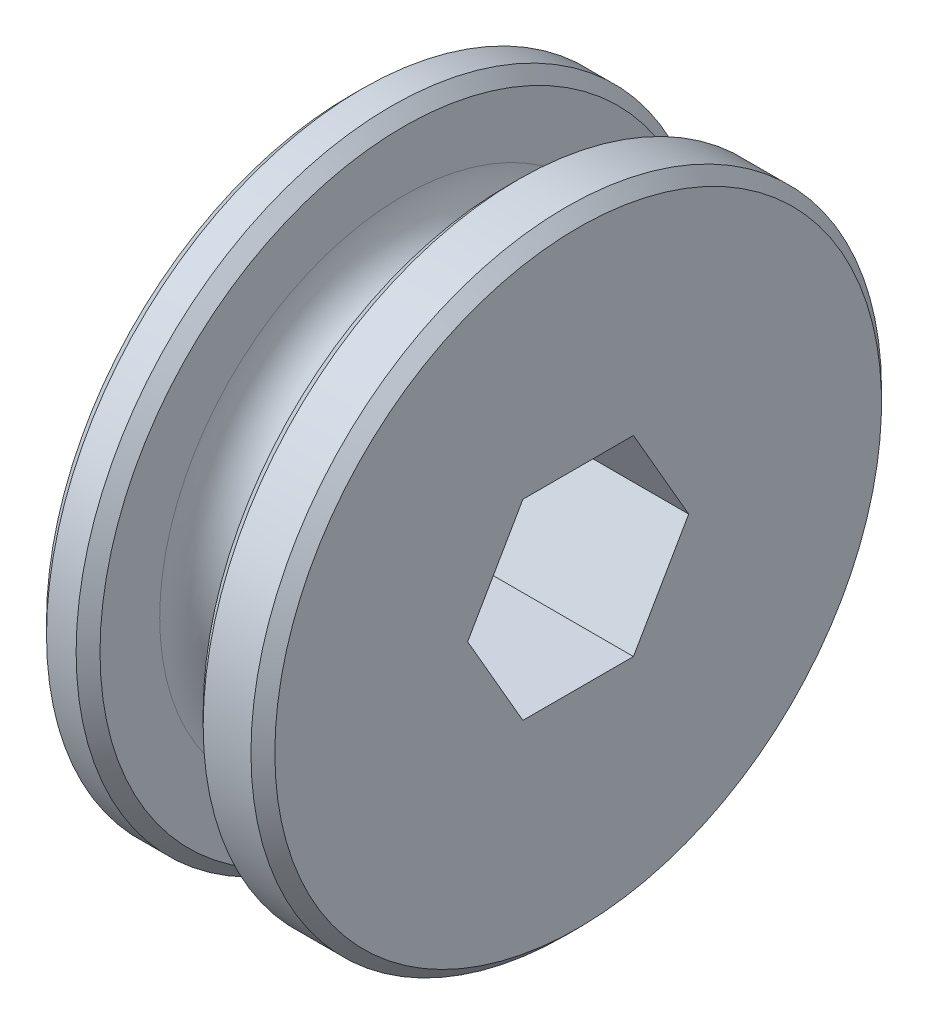
ISO-10303-21;
HEADER;
FILE_DESCRIPTION(('STEP AP214'),'2;1');
FILE_NAME('part.step','',(''),(''),'','','');
FILE_SCHEMA(('AUTOMOTIVE_DESIGN { 1 0 10303 214 1 1 1 1 }'));
ENDSEC;
DATA;
#1=APPLICATION_CONTEXT('core data for automotive mechanical design processes');
#2=APPLICATION_PROTOCOL_DEFINITION('international standard','automotive_design',2000,#1);
#3=PRODUCT_CONTEXT('',#1,'mechanical');
#4=PRODUCT('Part','Part','',(#3));
#5=PRODUCT_RELATED_PRODUCT_CATEGORY('part','',(#4));
#6=PRODUCT_DEFINITION_FORMATION('','',#4);
#7=PRODUCT_DEFINITION_CONTEXT('part definition',#1,'design');
#8=PRODUCT_DEFINITION('design','',#6,#7);
#9=PRODUCT_DEFINITION_SHAPE('','',#8);
#10=(LENGTH_UNIT() NAMED_UNIT(*) SI_UNIT(.MILLI.,.METRE.));
#11=(NAMED_UNIT(*) PLANE_ANGLE_UNIT() SI_UNIT($,.RADIAN.));
#12=(NAMED_UNIT(*) SI_UNIT($,.STERADIAN.) SOLID_ANGLE_UNIT());
#13=UNCERTAINTY_MEASURE_WITH_UNIT(LENGTH_MEASURE(1.E-05),#10,'distance_accuracy_value','');
#14=(GEOMETRIC_REPRESENTATION_CONTEXT(3) GLOBAL_UNCERTAINTY_ASSIGNED_CONTEXT((#13)) GLOBAL_UNIT_ASSIGNED_CONTEXT((#10,
#11,#12)) REPRESENTATION_CONTEXT('',''));
#15=CARTESIAN_POINT('',(0.,0.,0.));
#16=DIRECTION('',(0.,0.,1.));
#17=DIRECTION('',(1.,0.,0.));
#18=AXIS2_PLACEMENT_3D('',#15,#16,#17);
#19=CARTESIAN_POINT('',(6.985,0.,0.));
#20=DIRECTION('',(-1.,0.,0.));
#21=DIRECTION('',(0.,0.,1.));
#22=AXIS2_PLACEMENT_3D('',#19,#20,#21);
#23=TOROIDAL_SURFACE('',#22,16.1925,3.429);
#24=CARTESIAN_POINT('',(10.414,0.,0.));
#25=DIRECTION('',(-1.,0.,0.));
#26=DIRECTION('',(0.,0.,1.));
#27=AXIS2_PLACEMENT_3D('',#24,#25,#26);
#28=CIRCLE('',#27,16.1925);
#29=CARTESIAN_POINT('',(10.414,0.,16.1925));
#30=VERTEX_POINT('',#29);
#31=EDGE_CURVE('E141',#30,#30,#28,.T.);
#32=ORIENTED_EDGE('',*,*,#31,.T.);
#33=EDGE_LOOP('',(#32));
#34=FACE_BOUND('',#33,.T.);
#35=CARTESIAN_POINT('',(3.556,0.,0.));
#36=DIRECTION('',(-1.,0.,0.));
#37=DIRECTION('',(0.,0.,1.));
#38=AXIS2_PLACEMENT_3D('',#35,#36,#37);
#39=CIRCLE('',#38,16.1925);
#40=CARTESIAN_POINT('',(3.556,0.,16.1925));
#41=VERTEX_POINT('',#40);
#42=EDGE_CURVE('E151',#41,#41,#39,.T.);
#43=ORIENTED_EDGE('',*,*,#42,.F.);
#44=EDGE_LOOP('',(#43));
#45=FACE_BOUND('',#44,.T.);
#46=ADVANCED_FACE('F43',(#34,#45),#23,.F.);
#47=CARTESIAN_POINT('',(3.556,0.,0.));
#48=DIRECTION('',(-1.,0.,0.));
#49=DIRECTION('',(0.,0.,1.));
#50=AXIS2_PLACEMENT_3D('',#47,#48,#49);
#51=PLANE('',#50);
#52=CARTESIAN_POINT('',(3.556,0.,0.));
#53=DIRECTION('',(-1.,0.,0.));
#54=DIRECTION('',(0.,0.,1.));
#55=AXIS2_PLACEMENT_3D('',#52,#53,#54);
#56=CIRCLE('',#55,20.16125);
#57=CARTESIAN_POINT('',(3.556,0.,20.16125));
#58=VERTEX_POINT('',#57);
#59=EDGE_CURVE('E11',#58,#58,#56,.F.);
#60=ORIENTED_EDGE('',*,*,#59,.T.);
#61=EDGE_LOOP('',(#60));
#62=FACE_BOUND('',#61,.T.);
#63=ORIENTED_EDGE('',*,*,#42,.T.);
#64=EDGE_LOOP('',(#63));
#65=FACE_BOUND('',#64,.T.);
#66=ADVANCED_FACE('F187',(#62,#65),#51,.F.);
#67=CARTESIAN_POINT('',(0.,0.,0.));
#68=DIRECTION('',(-1.,0.,0.));
#69=DIRECTION('',(0.,0.,1.));
#70=AXIS2_PLACEMENT_3D('',#67,#68,#69);
#71=CYLINDRICAL_SURFACE('',#70,20.955);
#72=CARTESIAN_POINT('',(2.76225,0.,0.));
#73=DIRECTION('',(-1.,0.,0.));
#74=DIRECTION('',(0.,0.,1.));
#75=AXIS2_PLACEMENT_3D('',#72,#73,#74);
#76=CIRCLE('',#75,20.955);
#77=CARTESIAN_POINT('',(2.76225,0.,20.955));
#78=VERTEX_POINT('',#77);
#79=EDGE_CURVE('E52',#78,#78,#76,.T.);
#80=ORIENTED_EDGE('',*,*,#79,.T.);
#81=EDGE_LOOP('',(#80));
#82=FACE_BOUND('',#81,.T.);
#83=CARTESIAN_POINT('',(0.793750000000013,0.,0.));
#84=DIRECTION('',(-1.,0.,0.));
#85=DIRECTION('',(0.,0.,1.));
#86=AXIS2_PLACEMENT_3D('',#83,#84,#85);
#87=CIRCLE('',#86,20.955);
#88=CARTESIAN_POINT('',(0.793750000000013,0.,20.955));
#89=VERTEX_POINT('',#88);
#90=EDGE_CURVE('E157',#89,#89,#87,.F.);
#91=ORIENTED_EDGE('',*,*,#90,.T.);
#92=EDGE_LOOP('',(#91));
#93=FACE_BOUND('',#92,.T.);
#94=ADVANCED_FACE('F174',(#82,#93),#71,.T.);
#95=CARTESIAN_POINT('',(0.,0.,0.));
#96=DIRECTION('',(-1.,0.,0.));
#97=DIRECTION('',(0.,0.,1.));
#98=AXIS2_PLACEMENT_3D('',#95,#96,#97);
#99=PLANE('',#98);
#100=DIRECTION('',(0.,0.,1.));
#101=VECTOR('',#100,1.);
#102=CARTESIAN_POINT('',(0.,-6.3627,-3.67350655777283));
#103=LINE('',#102,#101);
#104=CARTESIAN_POINT('',(0.,-6.3627,-3.67350655777283));
#105=VERTEX_POINT('',#104);
#106=CARTESIAN_POINT('',(0.,-6.3627,3.67350655777283));
#107=VERTEX_POINT('',#106);
#108=EDGE_CURVE('E59',#105,#107,#103,.T.);
#109=ORIENTED_EDGE('',*,*,#108,.F.);
#110=DIRECTION('',(0.,-0.866025403784439,0.5));
#111=VECTOR('',#110,1.);
#112=CARTESIAN_POINT('',(0.,0.,-7.34701311554566));
#113=LINE('',#112,#111);
#114=CARTESIAN_POINT('',(0.,0.,-7.34701311554566));
#115=VERTEX_POINT('',#114);
#116=EDGE_CURVE('E115',#115,#105,#113,.T.);
#117=ORIENTED_EDGE('',*,*,#116,.F.);
#118=DIRECTION('',(0.,-0.866025403784439,-0.5));
#119=VECTOR('',#118,1.);
#120=CARTESIAN_POINT('',(0.,6.3627,-3.67350655777283));
#121=LINE('',#120,#119);
#122=CARTESIAN_POINT('',(0.,6.3627,-3.67350655777283));
#123=VERTEX_POINT('',#122);
#124=EDGE_CURVE('E118',#123,#115,#121,.T.);
#125=ORIENTED_EDGE('',*,*,#124,.F.);
#126=DIRECTION('',(0.,0.,-1.));
#127=VECTOR('',#126,1.);
#128=CARTESIAN_POINT('',(0.,6.3627,3.67350655777283));
#129=LINE('',#128,#127);
#130=CARTESIAN_POINT('',(0.,6.3627,3.67350655777283));
#131=VERTEX_POINT('',#130);
#132=EDGE_CURVE('E134',#131,#123,#129,.T.);
#133=ORIENTED_EDGE('',*,*,#132,.F.);
#134=DIRECTION('',(0.,0.866025403784439,-0.5));
#135=VECTOR('',#134,1.);
#136=CARTESIAN_POINT('',(0.,0.,7.34701311554566));
#137=LINE('',#136,#135);
#138=CARTESIAN_POINT('',(0.,0.,7.34701311554566));
#139=VERTEX_POINT('',#138);
#140=EDGE_CURVE('E131',#139,#131,#137,.T.);
#141=ORIENTED_EDGE('',*,*,#140,.F.);
#142=DIRECTION('',(0.,0.866025403784439,0.5));
#143=VECTOR('',#142,1.);
#144=CARTESIAN_POINT('',(0.,-6.3627,3.67350655777283));
#145=LINE('',#144,#143);
#146=EDGE_CURVE('E129',#107,#139,#145,.T.);
#147=ORIENTED_EDGE('',*,*,#146,.F.);
#148=EDGE_LOOP('',(#109,#117,#125,#133,#141,#147));
#149=FACE_BOUND('',#148,.T.);
#150=CARTESIAN_POINT('',(0.,0.,0.));
#151=DIRECTION('',(-1.,0.,0.));
#152=DIRECTION('',(0.,0.,1.));
#153=AXIS2_PLACEMENT_3D('',#150,#151,#152);
#154=CIRCLE('',#153,20.16125);
#155=CARTESIAN_POINT('',(0.,0.,20.16125));
#156=VERTEX_POINT('',#155);
#157=EDGE_CURVE('E154',#156,#156,#154,.T.);
#158=ORIENTED_EDGE('',*,*,#157,.T.);
#159=EDGE_LOOP('',(#158));
#160=FACE_BOUND('',#159,.T.);
#161=ADVANCED_FACE('F243',(#149,#160),#99,.T.);
#162=CARTESIAN_POINT('',(15.1765,0.,0.));
#163=DIRECTION('',(-1.,0.,0.));
#164=DIRECTION('',(0.,0.,1.));
#165=AXIS2_PLACEMENT_3D('',#162,#163,#164);
#166=PLANE('',#165);
#167=CARTESIAN_POINT('',(15.1765,0.,0.));
#168=DIRECTION('',(-1.,0.,0.));
#169=DIRECTION('',(0.,0.,1.));
#170=AXIS2_PLACEMENT_3D('',#167,#168,#169);
#171=CIRCLE('',#170,20.16125);
#172=CARTESIAN_POINT('',(15.1765,0.,20.16125));
#173=VERTEX_POINT('',#172);
#174=EDGE_CURVE('E166',#173,#173,#171,.F.);
#175=ORIENTED_EDGE('',*,*,#174,.T.);
#176=EDGE_LOOP('',(#175));
#177=FACE_BOUND('',#176,.T.);
#178=DIRECTION('',(0.,-0.866025403784439,0.5));
#179=VECTOR('',#178,1.);
#180=CARTESIAN_POINT('',(15.1765,0.,-7.34701311554566));
#181=LINE('',#180,#179);
#182=CARTESIAN_POINT('',(15.1765,0.,-7.34701311554566));
#183=VERTEX_POINT('',#182);
#184=CARTESIAN_POINT('',(15.1765,-6.3627,-3.67350655777283));
#185=VERTEX_POINT('',#184);
#186=EDGE_CURVE('E105',#183,#185,#181,.T.);
#187=ORIENTED_EDGE('',*,*,#186,.T.);
#188=DIRECTION('',(0.,0.,1.));
#189=VECTOR('',#188,1.);
#190=CARTESIAN_POINT('',(15.1765,-6.3627,-3.67350655777283));
#191=LINE('',#190,#189);
#192=CARTESIAN_POINT('',(15.1765,-6.3627,3.67350655777283));
#193=VERTEX_POINT('',#192);
#194=EDGE_CURVE('E99',#185,#193,#191,.T.);
#195=ORIENTED_EDGE('',*,*,#194,.T.);
#196=DIRECTION('',(0.,0.866025403784439,0.5));
#197=VECTOR('',#196,1.);
#198=CARTESIAN_POINT('',(15.1765,-6.3627,3.67350655777283));
#199=LINE('',#198,#197);
#200=CARTESIAN_POINT('',(15.1765,0.,7.34701311554566));
#201=VERTEX_POINT('',#200);
#202=EDGE_CURVE('E108',#193,#201,#199,.T.);
#203=ORIENTED_EDGE('',*,*,#202,.T.);
#204=DIRECTION('',(0.,0.866025403784439,-0.5));
#205=VECTOR('',#204,1.);
#206=CARTESIAN_POINT('',(15.1765,0.,7.34701311554566));
#207=LINE('',#206,#205);
#208=CARTESIAN_POINT('',(15.1765,6.3627,3.67350655777283));
#209=VERTEX_POINT('',#208);
#210=EDGE_CURVE('E67',#201,#209,#207,.T.);
#211=ORIENTED_EDGE('',*,*,#210,.T.);
#212=DIRECTION('',(0.,0.,-1.));
#213=VECTOR('',#212,1.);
#214=CARTESIAN_POINT('',(15.1765,6.3627,3.67350655777283));
#215=LINE('',#214,#213);
#216=CARTESIAN_POINT('',(15.1765,6.3627,-3.67350655777283));
#217=VERTEX_POINT('',#216);
#218=EDGE_CURVE('E122',#209,#217,#215,.T.);
#219=ORIENTED_EDGE('',*,*,#218,.T.);
#220=DIRECTION('',(0.,-0.866025403784439,-0.5));
#221=VECTOR('',#220,1.);
#222=CARTESIAN_POINT('',(15.1765,6.3627,-3.67350655777283));
#223=LINE('',#222,#221);
#224=EDGE_CURVE('E125',#217,#183,#223,.T.);
#225=ORIENTED_EDGE('',*,*,#224,.T.);
#226=EDGE_LOOP('',(#187,#195,#203,#211,#219,#225));
#227=FACE_BOUND('',#226,.T.);
#228=ADVANCED_FACE('F112',(#177,#227),#166,.F.);
#229=CARTESIAN_POINT('',(0.,0.,0.));
#230=DIRECTION('',(-1.,0.,0.));
#231=DIRECTION('',(0.,0.,1.));
#232=AXIS2_PLACEMENT_3D('',#229,#230,#231);
#233=CYLINDRICAL_SURFACE('',#232,20.955);
#234=CARTESIAN_POINT('',(14.38275,0.,0.));
#235=DIRECTION('',(-1.,0.,0.));
#236=DIRECTION('',(0.,0.,1.));
#237=AXIS2_PLACEMENT_3D('',#234,#235,#236);
#238=CIRCLE('',#237,20.955);
#239=CARTESIAN_POINT('',(14.38275,0.,20.955));
#240=VERTEX_POINT('',#239);
#241=EDGE_CURVE('E163',#240,#240,#238,.T.);
#242=ORIENTED_EDGE('',*,*,#241,.T.);
#243=EDGE_LOOP('',(#242));
#244=FACE_BOUND('',#243,.T.);
#245=CARTESIAN_POINT('',(11.20775,0.,0.));
#246=DIRECTION('',(-1.,0.,0.));
#247=DIRECTION('',(0.,0.,1.));
#248=AXIS2_PLACEMENT_3D('',#245,#246,#247);
#249=CIRCLE('',#248,20.955);
#250=CARTESIAN_POINT('',(11.20775,0.,20.955));
#251=VERTEX_POINT('',#250);
#252=EDGE_CURVE('E160',#251,#251,#249,.F.);
#253=ORIENTED_EDGE('',*,*,#252,.T.);
#254=EDGE_LOOP('',(#253));
#255=FACE_BOUND('',#254,.T.);
#256=ADVANCED_FACE('F225',(#244,#255),#233,.T.);
#257=CARTESIAN_POINT('',(10.414,0.,0.));
#258=DIRECTION('',(-1.,0.,0.));
#259=DIRECTION('',(0.,0.,1.));
#260=AXIS2_PLACEMENT_3D('',#257,#258,#259);
#261=PLANE('',#260);
#262=CARTESIAN_POINT('',(10.414,0.,0.));
#263=DIRECTION('',(-1.,0.,0.));
#264=DIRECTION('',(0.,0.,1.));
#265=AXIS2_PLACEMENT_3D('',#262,#263,#264);
#266=CIRCLE('',#265,20.16125);
#267=CARTESIAN_POINT('',(10.414,0.,20.16125));
#268=VERTEX_POINT('',#267);
#269=EDGE_CURVE('E169',#268,#268,#266,.T.);
#270=ORIENTED_EDGE('',*,*,#269,.T.);
#271=EDGE_LOOP('',(#270));
#272=FACE_BOUND('',#271,.T.);
#273=ORIENTED_EDGE('',*,*,#31,.F.);
#274=EDGE_LOOP('',(#273));
#275=FACE_BOUND('',#274,.T.);
#276=ADVANCED_FACE('F205',(#272,#275),#261,.T.);
#277=CARTESIAN_POINT('',(0.,0.,0.));
#278=DIRECTION('',(1.,0.,0.));
#279=DIRECTION('',(0.,0.,-1.));
#280=AXIS2_PLACEMENT_3D('',#277,#278,#279);
#281=CONICAL_SURFACE('',#280,20.16125,0.78539816339744);
#282=ORIENTED_EDGE('',*,*,#90,.F.);
#283=EDGE_LOOP('',(#282));
#284=FACE_BOUND('',#283,.T.);
#285=ORIENTED_EDGE('',*,*,#157,.F.);
#286=EDGE_LOOP('',(#285));
#287=FACE_BOUND('',#286,.T.);
#288=ADVANCED_FACE('F199',(#284,#287),#281,.T.);
#289=CARTESIAN_POINT('',(15.1765,-6.3627,-3.67350655777283));
#290=DIRECTION('',(0.,-1.,0.));
#291=DIRECTION('',(0.,0.,-1.));
#292=AXIS2_PLACEMENT_3D('',#289,#290,#291);
#293=PLANE('',#292);
#294=ORIENTED_EDGE('',*,*,#108,.T.);
#295=DIRECTION('',(-1.,0.,0.));
#296=VECTOR('',#295,1.);
#297=CARTESIAN_POINT('',(15.1765,-6.3627,3.67350655777283));
#298=LINE('',#297,#296);
#299=EDGE_CURVE('E95',#193,#107,#298,.T.);
#300=ORIENTED_EDGE('',*,*,#299,.F.);
#301=ORIENTED_EDGE('',*,*,#194,.F.);
#302=DIRECTION('',(-1.,0.,0.));
#303=VECTOR('',#302,1.);
#304=CARTESIAN_POINT('',(15.1765,-6.3627,-3.67350655777283));
#305=LINE('',#304,#303);
#306=EDGE_CURVE('E139',#185,#105,#305,.T.);
#307=ORIENTED_EDGE('',*,*,#306,.T.);
#308=EDGE_LOOP('',(#294,#300,#301,#307));
#309=FACE_BOUND('',#308,.T.);
#310=ADVANCED_FACE('F97',(#309),#293,.F.);
#311=CARTESIAN_POINT('',(15.1765,0.,-7.34701311554566));
#312=DIRECTION('',(0.,-0.5,-0.866025403784439));
#313=DIRECTION('',(0.,0.866025403784439,-0.5));
#314=AXIS2_PLACEMENT_3D('',#311,#312,#313);
#315=PLANE('',#314);
#316=ORIENTED_EDGE('',*,*,#116,.T.);
#317=ORIENTED_EDGE('',*,*,#306,.F.);
#318=ORIENTED_EDGE('',*,*,#186,.F.);
#319=DIRECTION('',(-1.,0.,0.));
#320=VECTOR('',#319,1.);
#321=CARTESIAN_POINT('',(15.1765,0.,-7.34701311554566));
#322=LINE('',#321,#320);
#323=EDGE_CURVE('E142',#183,#115,#322,.T.);
#324=ORIENTED_EDGE('',*,*,#323,.T.);
#325=EDGE_LOOP('',(#316,#317,#318,#324));
#326=FACE_BOUND('',#325,.T.);
#327=ADVANCED_FACE('F327',(#326),#315,.F.);
#328=CARTESIAN_POINT('',(15.1765,6.3627,-3.67350655777283));
#329=DIRECTION('',(0.,0.5,-0.866025403784439));
#330=DIRECTION('',(0.,0.866025403784439,0.5));
#331=AXIS2_PLACEMENT_3D('',#328,#329,#330);
#332=PLANE('',#331);
#333=ORIENTED_EDGE('',*,*,#124,.T.);
#334=ORIENTED_EDGE('',*,*,#323,.F.);
#335=ORIENTED_EDGE('',*,*,#224,.F.);
#336=DIRECTION('',(-1.,0.,0.));
#337=VECTOR('',#336,1.);
#338=CARTESIAN_POINT('',(15.1765,6.3627,-3.67350655777283));
#339=LINE('',#338,#337);
#340=EDGE_CURVE('E144',#217,#123,#339,.T.);
#341=ORIENTED_EDGE('',*,*,#340,.T.);
#342=EDGE_LOOP('',(#333,#334,#335,#341));
#343=FACE_BOUND('',#342,.T.);
#344=ADVANCED_FACE('F317',(#343),#332,.F.);
#345=CARTESIAN_POINT('',(15.1765,6.3627,3.67350655777283));
#346=DIRECTION('',(0.,1.,0.));
#347=DIRECTION('',(0.,0.,1.));
#348=AXIS2_PLACEMENT_3D('',#345,#346,#347);
#349=PLANE('',#348);
#350=ORIENTED_EDGE('',*,*,#132,.T.);
#351=ORIENTED_EDGE('',*,*,#340,.F.);
#352=ORIENTED_EDGE('',*,*,#218,.F.);
#353=DIRECTION('',(-1.,0.,0.));
#354=VECTOR('',#353,1.);
#355=CARTESIAN_POINT('',(15.1765,6.3627,3.67350655777283));
#356=LINE('',#355,#354);
#357=EDGE_CURVE('E146',#209,#131,#356,.T.);
#358=ORIENTED_EDGE('',*,*,#357,.T.);
#359=EDGE_LOOP('',(#350,#351,#352,#358));
#360=FACE_BOUND('',#359,.T.);
#361=ADVANCED_FACE('F308',(#360),#349,.F.);
#362=CARTESIAN_POINT('',(15.1765,0.,7.34701311554566));
#363=DIRECTION('',(0.,0.5,0.866025403784439));
#364=DIRECTION('',(0.,-0.866025403784439,0.5));
#365=AXIS2_PLACEMENT_3D('',#362,#363,#364);
#366=PLANE('',#365);
#367=ORIENTED_EDGE('',*,*,#140,.T.);
#368=ORIENTED_EDGE('',*,*,#357,.F.);
#369=ORIENTED_EDGE('',*,*,#210,.F.);
#370=DIRECTION('',(-1.,0.,0.));
#371=VECTOR('',#370,1.);
#372=CARTESIAN_POINT('',(15.1765,0.,7.34701311554566));
#373=LINE('',#372,#371);
#374=EDGE_CURVE('E104',#201,#139,#373,.T.);
#375=ORIENTED_EDGE('',*,*,#374,.T.);
#376=EDGE_LOOP('',(#367,#368,#369,#375));
#377=FACE_BOUND('',#376,.T.);
#378=ADVANCED_FACE('F219',(#377),#366,.F.);
#379=CARTESIAN_POINT('',(15.1765,-6.3627,3.67350655777283));
#380=DIRECTION('',(0.,-0.5,0.866025403784439));
#381=DIRECTION('',(0.,-0.866025403784439,-0.5));
#382=AXIS2_PLACEMENT_3D('',#379,#380,#381);
#383=PLANE('',#382);
#384=ORIENTED_EDGE('',*,*,#146,.T.);
#385=ORIENTED_EDGE('',*,*,#374,.F.);
#386=ORIENTED_EDGE('',*,*,#202,.F.);
#387=ORIENTED_EDGE('',*,*,#299,.T.);
#388=EDGE_LOOP('',(#384,#385,#386,#387));
#389=FACE_BOUND('',#388,.T.);
#390=ADVANCED_FACE('F109',(#389),#383,.F.);
#391=CARTESIAN_POINT('',(14.38275,0.,0.));
#392=DIRECTION('',(-1.,0.,0.));
#393=DIRECTION('',(0.,0.,1.));
#394=AXIS2_PLACEMENT_3D('',#391,#392,#393);
#395=CONICAL_SURFACE('',#394,20.955,0.78539816339745);
#396=ORIENTED_EDGE('',*,*,#174,.F.);
#397=EDGE_LOOP('',(#396));
#398=FACE_BOUND('',#397,.T.);
#399=ORIENTED_EDGE('',*,*,#241,.F.);
#400=EDGE_LOOP('',(#399));
#401=FACE_BOUND('',#400,.T.);
#402=ADVANCED_FACE('F183',(#398,#401),#395,.T.);
#403=CARTESIAN_POINT('',(10.414,0.,0.));
#404=DIRECTION('',(1.,0.,0.));
#405=DIRECTION('',(0.,0.,-1.));
#406=AXIS2_PLACEMENT_3D('',#403,#404,#405);
#407=CONICAL_SURFACE('',#406,20.16125,0.785398163397448);
#408=ORIENTED_EDGE('',*,*,#252,.F.);
#409=EDGE_LOOP('',(#408));
#410=FACE_BOUND('',#409,.T.);
#411=ORIENTED_EDGE('',*,*,#269,.F.);
#412=EDGE_LOOP('',(#411));
#413=FACE_BOUND('',#412,.T.);
#414=ADVANCED_FACE('F178',(#410,#413),#407,.T.);
#415=CARTESIAN_POINT('',(2.76225,0.,0.));
#416=DIRECTION('',(-1.,0.,0.));
#417=DIRECTION('',(0.,0.,1.));
#418=AXIS2_PLACEMENT_3D('',#415,#416,#417);
#419=CONICAL_SURFACE('',#418,20.955,0.785398163397448);
#420=CARTESIAN_POINT('',(3.556,0.,20.16125));
#421=CARTESIAN_POINT('',(3.54773177083333,0.,20.1695182291667));
#422=CARTESIAN_POINT('',(3.53946354166667,0.,20.1777864583333));
#423=CARTESIAN_POINT('',(3.52292708333333,0.,20.1943229166667));
#424=CARTESIAN_POINT('',(3.51465885416667,0.,20.2025911458333));
#425=CARTESIAN_POINT('',(3.49812239583333,0.,20.2191276041667));
#426=CARTESIAN_POINT('',(3.48985416666667,0.,20.2273958333333));
#427=CARTESIAN_POINT('',(3.47331770833333,0.,20.2439322916667));
#428=CARTESIAN_POINT('',(3.46504947916667,0.,20.2522005208333));
#429=CARTESIAN_POINT('',(3.44851302083333,0.,20.2687369791667));
#430=CARTESIAN_POINT('',(3.44024479166667,0.,20.2770052083333));
#431=CARTESIAN_POINT('',(3.42370833333333,0.,20.2935416666667));
#432=CARTESIAN_POINT('',(3.41544010416667,0.,20.3018098958333));
#433=CARTESIAN_POINT('',(3.39890364583333,0.,20.3183463541667));
#434=CARTESIAN_POINT('',(3.39063541666667,0.,20.3266145833333));
#435=CARTESIAN_POINT('',(3.37409895833333,0.,20.3431510416667));
#436=CARTESIAN_POINT('',(3.36583072916667,0.,20.3514192708333));
#437=CARTESIAN_POINT('',(3.34929427083333,0.,20.3679557291667));
#438=CARTESIAN_POINT('',(3.34102604166667,0.,20.3762239583333));
#439=CARTESIAN_POINT('',(3.32448958333333,0.,20.3927604166667));
#440=CARTESIAN_POINT('',(3.31622135416667,0.,20.4010286458333));
#441=CARTESIAN_POINT('',(3.29968489583333,0.,20.4175651041667));
#442=CARTESIAN_POINT('',(3.29141666666667,0.,20.4258333333333));
#443=CARTESIAN_POINT('',(3.27488020833333,0.,20.4423697916667));
#444=CARTESIAN_POINT('',(3.26661197916667,0.,20.4506380208333));
#445=CARTESIAN_POINT('',(3.25007552083333,0.,20.4671744791667));
#446=CARTESIAN_POINT('',(3.24180729166667,0.,20.4754427083333));
#447=CARTESIAN_POINT('',(3.22527083333333,0.,20.4919791666667));
#448=CARTESIAN_POINT('',(3.21700260416667,0.,20.5002473958333));
#449=CARTESIAN_POINT('',(3.20046614583333,0.,20.5167838541667));
#450=CARTESIAN_POINT('',(3.19219791666667,0.,20.5250520833333));
#451=CARTESIAN_POINT('',(3.17566145833333,0.,20.5415885416667));
#452=CARTESIAN_POINT('',(3.16739322916667,0.,20.5498567708333));
#453=CARTESIAN_POINT('',(3.15085677083333,0.,20.5663932291667));
#454=CARTESIAN_POINT('',(3.14258854166667,0.,20.5746614583333));
#455=CARTESIAN_POINT('',(3.12605208333333,0.,20.5911979166667));
#456=CARTESIAN_POINT('',(3.11778385416667,0.,20.5994661458333));
#457=CARTESIAN_POINT('',(3.10124739583333,0.,20.6160026041667));
#458=CARTESIAN_POINT('',(3.09297916666667,0.,20.6242708333333));
#459=CARTESIAN_POINT('',(3.07644270833333,0.,20.6408072916667));
#460=CARTESIAN_POINT('',(3.06817447916667,0.,20.6490755208333));
#461=CARTESIAN_POINT('',(3.05163802083333,0.,20.6656119791667));
#462=CARTESIAN_POINT('',(3.04336979166667,0.,20.6738802083333));
#463=CARTESIAN_POINT('',(3.02683333333333,0.,20.6904166666667));
#464=CARTESIAN_POINT('',(3.01856510416667,0.,20.6986848958333));
#465=CARTESIAN_POINT('',(3.00202864583333,0.,20.7152213541667));
#466=CARTESIAN_POINT('',(2.99376041666667,0.,20.7234895833333));
#467=CARTESIAN_POINT('',(2.97722395833333,0.,20.7400260416667));
#468=CARTESIAN_POINT('',(2.96895572916666,0.,20.7482942708333));
#469=CARTESIAN_POINT('',(2.95241927083333,0.,20.7648307291667));
#470=CARTESIAN_POINT('',(2.94415104166666,0.,20.7730989583333));
#471=CARTESIAN_POINT('',(2.92761458333333,0.,20.7896354166667));
#472=CARTESIAN_POINT('',(2.91934635416666,0.,20.7979036458333));
#473=CARTESIAN_POINT('',(2.90280989583333,0.,20.8144401041667));
#474=CARTESIAN_POINT('',(2.89454166666667,0.,20.8227083333333));
#475=CARTESIAN_POINT('',(2.87800520833333,0.,20.8392447916667));
#476=CARTESIAN_POINT('',(2.86973697916666,0.,20.8475130208333));
#477=CARTESIAN_POINT('',(2.85320052083333,0.,20.8640494791667));
#478=CARTESIAN_POINT('',(2.84493229166666,0.,20.8723177083333));
#479=CARTESIAN_POINT('',(2.82839583333333,0.,20.8888541666667));
#480=CARTESIAN_POINT('',(2.82012760416666,0.,20.8971223958333));
#481=CARTESIAN_POINT('',(2.80359114583333,0.,20.9136588541667));
#482=CARTESIAN_POINT('',(2.79532291666666,0.,20.9219270833333));
#483=CARTESIAN_POINT('',(2.77878645833333,0.,20.9384635416667));
#484=CARTESIAN_POINT('',(2.77051822916666,0.,20.9467317708333));
#485=CARTESIAN_POINT('',(2.76225,0.,20.955));
#486=B_SPLINE_CURVE_WITH_KNOTS('',3,(#420,#421,#422,#423,#424,#425,#426,#427,#428,#429,#430,
#431,#432,#433,#434,#435,#436,#437,#438,#439,#440,#441,#442,#443,#444,#445,#446,#447,#448,#449,
#450,#451,#452,#453,#454,#455,#456,#457,#458,#459,#460,#461,#462,#463,#464,#465,#466,#467,#468,
#469,#470,#471,#472,#473,#474,#475,#476,#477,#478,#479,#480,#481,#482,#483,#484,#485),
.UNSPECIFIED.,.F.,.F.,(4,2,2,2,2,2,2,2,2,2,2,2,2,2,2,2,2,2,2,2,2,2,2,2,2,2,2,2,2,2,2,2,4),(0.,
0.0350791254729274,0.0701582509458521,0.10523737641878,0.140316501891707,0.175395627364632,
0.210474752837559,0.245553878310486,0.280633003783411,0.315712129256338,0.350791254729265,
0.38587038020219,0.420949505675118,0.456028631148045,0.491107756620972,0.526186882093897,
0.561266007566824,0.596345133039751,0.631424258512676,0.666503383985604,0.701582509458531,
0.736661634931456,0.771740760404383,0.80681988587731,0.841899011350235,0.876978136823162,
0.91205726229609,0.947136387769017,0.982215513241942,1.01729463871487,1.0523737641878,
1.08745288966072,1.12253201513365),.UNSPECIFIED.);
#487=EDGE_CURVE('BSEAM46',#58,#78,#486,.T.);
#488=ORIENTED_EDGE('',*,*,#59,.F.);
#489=ORIENTED_EDGE('',*,*,#79,.F.);
#490=ORIENTED_EDGE('',*,*,#487,.T.);
#491=ORIENTED_EDGE('',*,*,#487,.F.);
#492=EDGE_LOOP('',(#488,#490,#489,#491));
#493=FACE_BOUND('',#492,.T.);
#494=ADVANCED_FACE('F46',(#493),#419,.T.);
#495=CLOSED_SHELL('',(#46,#66,#94,#161,#228,#256,#276,#288,#310,#327,#344,#361,#378,#390,#402,
#414,#494));
#496=MANIFOLD_SOLID_BREP('B2',#495);
#497=ADVANCED_BREP_SHAPE_REPRESENTATION('',(#18,#496),#14);
#498=SHAPE_DEFINITION_REPRESENTATION(#9,#497);
ENDSEC;
END-ISO-10303-21;
